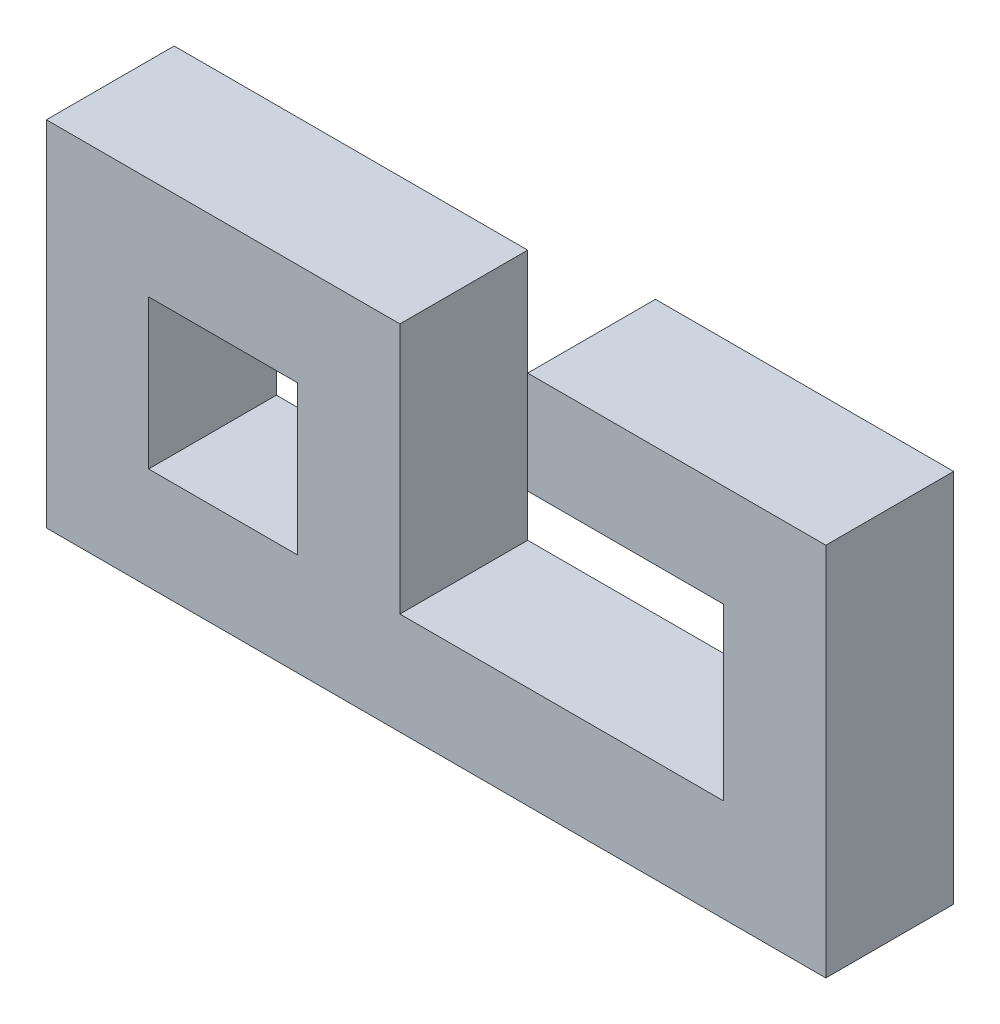
ISO-10303-21;
HEADER;
FILE_DESCRIPTION(('STEP AP214'),'2;1');
FILE_NAME('part.step','',(''),(''),'','','');
FILE_SCHEMA(('AUTOMOTIVE_DESIGN { 1 0 10303 214 1 1 1 1 }'));
ENDSEC;
DATA;
#1=APPLICATION_CONTEXT('core data for automotive mechanical design processes');
#2=APPLICATION_PROTOCOL_DEFINITION('international standard','automotive_design',2000,#1);
#3=PRODUCT_CONTEXT('',#1,'mechanical');
#4=PRODUCT('Part','Part','',(#3));
#5=PRODUCT_RELATED_PRODUCT_CATEGORY('part','',(#4));
#6=PRODUCT_DEFINITION_FORMATION('','',#4);
#7=PRODUCT_DEFINITION_CONTEXT('part definition',#1,'design');
#8=PRODUCT_DEFINITION('design','',#6,#7);
#9=PRODUCT_DEFINITION_SHAPE('','',#8);
#10=(LENGTH_UNIT() NAMED_UNIT(*) SI_UNIT(.MILLI.,.METRE.));
#11=(NAMED_UNIT(*) PLANE_ANGLE_UNIT() SI_UNIT($,.RADIAN.));
#12=(NAMED_UNIT(*) SI_UNIT($,.STERADIAN.) SOLID_ANGLE_UNIT());
#13=UNCERTAINTY_MEASURE_WITH_UNIT(LENGTH_MEASURE(1.E-05),#10,'distance_accuracy_value','');
#14=(GEOMETRIC_REPRESENTATION_CONTEXT(3) GLOBAL_UNCERTAINTY_ASSIGNED_CONTEXT((#13)) GLOBAL_UNIT_ASSIGNED_CONTEXT((#10,
#11,#12)) REPRESENTATION_CONTEXT('',''));
#15=CARTESIAN_POINT('',(0.,0.,0.));
#16=DIRECTION('',(0.,0.,1.));
#17=DIRECTION('',(1.,0.,0.));
#18=AXIS2_PLACEMENT_3D('',#15,#16,#17);
#19=CARTESIAN_POINT('',(0.,0.,3.));
#20=DIRECTION('',(0.,0.,-1.));
#21=DIRECTION('',(-1.,0.,0.));
#22=AXIS2_PLACEMENT_3D('',#19,#20,#21);
#23=PLANE('',#22);
#24=DIRECTION('',(-1.,0.,0.));
#25=VECTOR('',#24,1.);
#26=CARTESIAN_POINT('',(-10.1589932240535,4.48414845360825,3.));
#27=LINE('',#26,#25);
#28=CARTESIAN_POINT('',(-1.85899322405349,4.48414845360825,3.));
#29=VERTEX_POINT('',#28);
#30=CARTESIAN_POINT('',(-10.1589932240535,4.48414845360825,3.));
#31=VERTEX_POINT('',#30);
#32=EDGE_CURVE('E170',#29,#31,#27,.T.);
#33=ORIENTED_EDGE('',*,*,#32,.T.);
#34=DIRECTION('',(0.,-1.,0.));
#35=VECTOR('',#34,1.);
#36=CARTESIAN_POINT('',(-10.1589932240535,4.48414845360825,3.));
#37=LINE('',#36,#35);
#38=CARTESIAN_POINT('',(-10.1589932240535,-3.81585154639175,3.));
#39=VERTEX_POINT('',#38);
#40=EDGE_CURVE('E173',#31,#39,#37,.T.);
#41=ORIENTED_EDGE('',*,*,#40,.T.);
#42=DIRECTION('',(1.,0.,0.));
#43=VECTOR('',#42,1.);
#44=CARTESIAN_POINT('',(-10.1589932240535,-3.81585154639175,3.));
#45=LINE('',#44,#43);
#46=CARTESIAN_POINT('',(8.14100677594651,-3.81585154639175,3.));
#47=VERTEX_POINT('',#46);
#48=EDGE_CURVE('E176',#39,#47,#45,.T.);
#49=ORIENTED_EDGE('',*,*,#48,.T.);
#50=DIRECTION('',(0.,1.,0.));
#51=VECTOR('',#50,1.);
#52=CARTESIAN_POINT('',(8.14100677594651,4.98414845360825,3.));
#53=LINE('',#52,#51);
#54=CARTESIAN_POINT('',(8.14100677594651,4.98414845360825,3.));
#55=VERTEX_POINT('',#54);
#56=EDGE_CURVE('E178',#47,#55,#53,.T.);
#57=ORIENTED_EDGE('',*,*,#56,.T.);
#58=DIRECTION('',(-1.,0.,0.));
#59=VECTOR('',#58,1.);
#60=CARTESIAN_POINT('',(1.14100677594651,4.98414845360825,3.));
#61=LINE('',#60,#59);
#62=CARTESIAN_POINT('',(1.14100677594651,4.98414845360825,3.));
#63=VERTEX_POINT('',#62);
#64=EDGE_CURVE('E180',#55,#63,#61,.T.);
#65=ORIENTED_EDGE('',*,*,#64,.T.);
#66=DIRECTION('',(0.,-1.,0.));
#67=VECTOR('',#66,1.);
#68=CARTESIAN_POINT('',(1.14100677594651,2.58414845360825,3.));
#69=LINE('',#68,#67);
#70=CARTESIAN_POINT('',(1.14100677594651,2.58414845360825,3.));
#71=VERTEX_POINT('',#70);
#72=EDGE_CURVE('E182',#63,#71,#69,.T.);
#73=ORIENTED_EDGE('',*,*,#72,.T.);
#74=DIRECTION('',(1.,0.,0.));
#75=VECTOR('',#74,1.);
#76=CARTESIAN_POINT('',(5.74100677594651,2.58414845360825,3.));
#77=LINE('',#76,#75);
#78=CARTESIAN_POINT('',(5.74100677594651,2.58414845360825,3.));
#79=VERTEX_POINT('',#78);
#80=EDGE_CURVE('E184',#71,#79,#77,.T.);
#81=ORIENTED_EDGE('',*,*,#80,.T.);
#82=DIRECTION('',(0.,-1.,0.));
#83=VECTOR('',#82,1.);
#84=CARTESIAN_POINT('',(5.74100677594651,-1.41585154639175,3.));
#85=LINE('',#84,#83);
#86=CARTESIAN_POINT('',(5.74100677594651,-1.41585154639175,3.));
#87=VERTEX_POINT('',#86);
#88=EDGE_CURVE('E186',#79,#87,#85,.T.);
#89=ORIENTED_EDGE('',*,*,#88,.T.);
#90=DIRECTION('',(-1.,0.,0.));
#91=VECTOR('',#90,1.);
#92=CARTESIAN_POINT('',(-1.85899322405349,-1.41585154639175,3.));
#93=LINE('',#92,#91);
#94=CARTESIAN_POINT('',(-1.85899322405349,-1.41585154639175,3.));
#95=VERTEX_POINT('',#94);
#96=EDGE_CURVE('E188',#87,#95,#93,.T.);
#97=ORIENTED_EDGE('',*,*,#96,.T.);
#98=DIRECTION('',(0.,1.,0.));
#99=VECTOR('',#98,1.);
#100=CARTESIAN_POINT('',(-1.85899322405349,4.48414845360825,3.));
#101=LINE('',#100,#99);
#102=EDGE_CURVE('E190',#95,#29,#101,.T.);
#103=ORIENTED_EDGE('',*,*,#102,.T.);
#104=EDGE_LOOP('',(#33,#41,#49,#57,#65,#73,#81,#89,#97,#103));
#105=FACE_BOUND('',#104,.T.);
#106=DIRECTION('',(0.,-1.,0.));
#107=VECTOR('',#106,1.);
#108=CARTESIAN_POINT('',(-7.75899322405349,2.08414845360825,3.));
#109=LINE('',#108,#107);
#110=CARTESIAN_POINT('',(-7.75899322405349,2.08414845360825,3.));
#111=VERTEX_POINT('',#110);
#112=CARTESIAN_POINT('',(-7.75899322405349,-1.41585154639175,3.));
#113=VERTEX_POINT('',#112);
#114=EDGE_CURVE('E134',#111,#113,#109,.T.);
#115=ORIENTED_EDGE('',*,*,#114,.F.);
#116=DIRECTION('',(-1.,0.,0.));
#117=VECTOR('',#116,1.);
#118=CARTESIAN_POINT('',(-7.75899322405349,2.08414845360825,3.));
#119=LINE('',#118,#117);
#120=CARTESIAN_POINT('',(-4.25899322405349,2.08414845360825,3.));
#121=VERTEX_POINT('',#120);
#122=EDGE_CURVE('E156',#121,#111,#119,.T.);
#123=ORIENTED_EDGE('',*,*,#122,.F.);
#124=DIRECTION('',(0.,1.,0.));
#125=VECTOR('',#124,1.);
#126=CARTESIAN_POINT('',(-4.25899322405349,2.08414845360825,3.));
#127=LINE('',#126,#125);
#128=CARTESIAN_POINT('',(-4.25899322405349,-1.41585154639175,3.));
#129=VERTEX_POINT('',#128);
#130=EDGE_CURVE('E154',#129,#121,#127,.T.);
#131=ORIENTED_EDGE('',*,*,#130,.F.);
#132=DIRECTION('',(1.,0.,0.));
#133=VECTOR('',#132,1.);
#134=CARTESIAN_POINT('',(-7.75899322405349,-1.41585154639175,3.));
#135=LINE('',#134,#133);
#136=EDGE_CURVE('E142',#113,#129,#135,.T.);
#137=ORIENTED_EDGE('',*,*,#136,.F.);
#138=EDGE_LOOP('',(#115,#123,#131,#137));
#139=FACE_BOUND('',#138,.T.);
#140=ADVANCED_FACE('F33',(#105,#139),#23,.F.);
#141=CARTESIAN_POINT('',(0.,0.,0.));
#142=DIRECTION('',(0.,0.,-1.));
#143=DIRECTION('',(-1.,0.,0.));
#144=AXIS2_PLACEMENT_3D('',#141,#142,#143);
#145=PLANE('',#144);
#146=DIRECTION('',(-1.,0.,0.));
#147=VECTOR('',#146,1.);
#148=CARTESIAN_POINT('',(-10.1589932240535,4.48414845360825,0.));
#149=LINE('',#148,#147);
#150=CARTESIAN_POINT('',(-1.85899322405349,4.48414845360825,0.));
#151=VERTEX_POINT('',#150);
#152=CARTESIAN_POINT('',(-10.1589932240535,4.48414845360825,0.));
#153=VERTEX_POINT('',#152);
#154=EDGE_CURVE('E150',#151,#153,#149,.T.);
#155=ORIENTED_EDGE('',*,*,#154,.F.);
#156=DIRECTION('',(0.,1.,0.));
#157=VECTOR('',#156,1.);
#158=CARTESIAN_POINT('',(-1.85899322405349,4.48414845360825,0.));
#159=LINE('',#158,#157);
#160=CARTESIAN_POINT('',(-1.85899322405349,-1.41585154639175,0.));
#161=VERTEX_POINT('',#160);
#162=EDGE_CURVE('E174',#161,#151,#159,.T.);
#163=ORIENTED_EDGE('',*,*,#162,.F.);
#164=DIRECTION('',(-1.,0.,0.));
#165=VECTOR('',#164,1.);
#166=CARTESIAN_POINT('',(-1.85899322405349,-1.41585154639175,0.));
#167=LINE('',#166,#165);
#168=CARTESIAN_POINT('',(5.74100677594651,-1.41585154639175,0.));
#169=VERTEX_POINT('',#168);
#170=EDGE_CURVE('E209',#169,#161,#167,.T.);
#171=ORIENTED_EDGE('',*,*,#170,.F.);
#172=DIRECTION('',(0.,-1.,0.));
#173=VECTOR('',#172,1.);
#174=CARTESIAN_POINT('',(5.74100677594651,-1.41585154639175,0.));
#175=LINE('',#174,#173);
#176=CARTESIAN_POINT('',(5.74100677594651,2.58414845360825,0.));
#177=VERTEX_POINT('',#176);
#178=EDGE_CURVE('E207',#177,#169,#175,.T.);
#179=ORIENTED_EDGE('',*,*,#178,.F.);
#180=DIRECTION('',(1.,0.,0.));
#181=VECTOR('',#180,1.);
#182=CARTESIAN_POINT('',(5.74100677594651,2.58414845360825,0.));
#183=LINE('',#182,#181);
#184=CARTESIAN_POINT('',(1.14100677594651,2.58414845360825,0.));
#185=VERTEX_POINT('',#184);
#186=EDGE_CURVE('E205',#185,#177,#183,.T.);
#187=ORIENTED_EDGE('',*,*,#186,.F.);
#188=DIRECTION('',(0.,-1.,0.));
#189=VECTOR('',#188,1.);
#190=CARTESIAN_POINT('',(1.14100677594651,2.58414845360825,0.));
#191=LINE('',#190,#189);
#192=CARTESIAN_POINT('',(1.14100677594651,4.98414845360825,0.));
#193=VERTEX_POINT('',#192);
#194=EDGE_CURVE('E203',#193,#185,#191,.T.);
#195=ORIENTED_EDGE('',*,*,#194,.F.);
#196=DIRECTION('',(-1.,0.,0.));
#197=VECTOR('',#196,1.);
#198=CARTESIAN_POINT('',(1.14100677594651,4.98414845360825,0.));
#199=LINE('',#198,#197);
#200=CARTESIAN_POINT('',(8.14100677594651,4.98414845360825,0.));
#201=VERTEX_POINT('',#200);
#202=EDGE_CURVE('E201',#201,#193,#199,.T.);
#203=ORIENTED_EDGE('',*,*,#202,.F.);
#204=DIRECTION('',(0.,1.,0.));
#205=VECTOR('',#204,1.);
#206=CARTESIAN_POINT('',(8.14100677594651,4.98414845360825,0.));
#207=LINE('',#206,#205);
#208=CARTESIAN_POINT('',(8.14100677594651,-3.81585154639175,0.));
#209=VERTEX_POINT('',#208);
#210=EDGE_CURVE('E199',#209,#201,#207,.T.);
#211=ORIENTED_EDGE('',*,*,#210,.F.);
#212=DIRECTION('',(1.,0.,0.));
#213=VECTOR('',#212,1.);
#214=CARTESIAN_POINT('',(-10.1589932240535,-3.81585154639175,0.));
#215=LINE('',#214,#213);
#216=CARTESIAN_POINT('',(-10.1589932240535,-3.81585154639175,0.));
#217=VERTEX_POINT('',#216);
#218=EDGE_CURVE('E197',#217,#209,#215,.T.);
#219=ORIENTED_EDGE('',*,*,#218,.F.);
#220=DIRECTION('',(0.,-1.,0.));
#221=VECTOR('',#220,1.);
#222=CARTESIAN_POINT('',(-10.1589932240535,4.48414845360825,0.));
#223=LINE('',#222,#221);
#224=EDGE_CURVE('E195',#153,#217,#223,.T.);
#225=ORIENTED_EDGE('',*,*,#224,.F.);
#226=EDGE_LOOP('',(#155,#163,#171,#179,#187,#195,#203,#211,#219,#225));
#227=FACE_BOUND('',#226,.T.);
#228=DIRECTION('',(-1.,0.,0.));
#229=VECTOR('',#228,1.);
#230=CARTESIAN_POINT('',(-7.75899322405349,2.08414845360825,0.));
#231=LINE('',#230,#229);
#232=CARTESIAN_POINT('',(-4.25899322405349,2.08414845360825,0.));
#233=VERTEX_POINT('',#232);
#234=CARTESIAN_POINT('',(-7.75899322405349,2.08414845360825,0.));
#235=VERTEX_POINT('',#234);
#236=EDGE_CURVE('E143',#233,#235,#231,.T.);
#237=ORIENTED_EDGE('',*,*,#236,.T.);
#238=DIRECTION('',(0.,-1.,0.));
#239=VECTOR('',#238,1.);
#240=CARTESIAN_POINT('',(-7.75899322405349,2.08414845360825,0.));
#241=LINE('',#240,#239);
#242=CARTESIAN_POINT('',(-7.75899322405349,-1.41585154639175,0.));
#243=VERTEX_POINT('',#242);
#244=EDGE_CURVE('E56',#235,#243,#241,.T.);
#245=ORIENTED_EDGE('',*,*,#244,.T.);
#246=DIRECTION('',(1.,0.,0.));
#247=VECTOR('',#246,1.);
#248=CARTESIAN_POINT('',(-7.75899322405349,-1.41585154639175,0.));
#249=LINE('',#248,#247);
#250=CARTESIAN_POINT('',(-4.25899322405349,-1.41585154639175,0.));
#251=VERTEX_POINT('',#250);
#252=EDGE_CURVE('E149',#243,#251,#249,.T.);
#253=ORIENTED_EDGE('',*,*,#252,.T.);
#254=DIRECTION('',(0.,1.,0.));
#255=VECTOR('',#254,1.);
#256=CARTESIAN_POINT('',(-4.25899322405349,2.08414845360825,0.));
#257=LINE('',#256,#255);
#258=EDGE_CURVE('E162',#251,#233,#257,.T.);
#259=ORIENTED_EDGE('',*,*,#258,.T.);
#260=EDGE_LOOP('',(#237,#245,#253,#259));
#261=FACE_BOUND('',#260,.T.);
#262=ADVANCED_FACE('F245',(#227,#261),#145,.T.);
#263=CARTESIAN_POINT('',(-10.1589932240535,4.48414845360825,3.));
#264=DIRECTION('',(0.,-1.,0.));
#265=DIRECTION('',(0.,0.,-1.));
#266=AXIS2_PLACEMENT_3D('',#263,#264,#265);
#267=PLANE('',#266);
#268=ORIENTED_EDGE('',*,*,#154,.T.);
#269=DIRECTION('',(0.,0.,-1.));
#270=VECTOR('',#269,1.);
#271=CARTESIAN_POINT('',(-10.1589932240535,4.48414845360825,3.));
#272=LINE('',#271,#270);
#273=EDGE_CURVE('E11',#31,#153,#272,.T.);
#274=ORIENTED_EDGE('',*,*,#273,.F.);
#275=ORIENTED_EDGE('',*,*,#32,.F.);
#276=DIRECTION('',(0.,0.,-1.));
#277=VECTOR('',#276,1.);
#278=CARTESIAN_POINT('',(-1.85899322405349,4.48414845360825,3.));
#279=LINE('',#278,#277);
#280=EDGE_CURVE('E192',#29,#151,#279,.T.);
#281=ORIENTED_EDGE('',*,*,#280,.T.);
#282=EDGE_LOOP('',(#268,#274,#275,#281));
#283=FACE_BOUND('',#282,.T.);
#284=ADVANCED_FACE('F35',(#283),#267,.F.);
#285=CARTESIAN_POINT('',(-10.1589932240535,4.48414845360825,3.));
#286=DIRECTION('',(1.,0.,0.));
#287=DIRECTION('',(0.,0.,-1.));
#288=AXIS2_PLACEMENT_3D('',#285,#286,#287);
#289=PLANE('',#288);
#290=ORIENTED_EDGE('',*,*,#224,.T.);
#291=DIRECTION('',(0.,0.,-1.));
#292=VECTOR('',#291,1.);
#293=CARTESIAN_POINT('',(-10.1589932240535,-3.81585154639175,3.));
#294=LINE('',#293,#292);
#295=EDGE_CURVE('E41',#39,#217,#294,.T.);
#296=ORIENTED_EDGE('',*,*,#295,.F.);
#297=ORIENTED_EDGE('',*,*,#40,.F.);
#298=ORIENTED_EDGE('',*,*,#273,.T.);
#299=EDGE_LOOP('',(#290,#296,#297,#298));
#300=FACE_BOUND('',#299,.T.);
#301=ADVANCED_FACE('F262',(#300),#289,.F.);
#302=CARTESIAN_POINT('',(-10.1589932240535,-3.81585154639175,3.));
#303=DIRECTION('',(0.,1.,0.));
#304=DIRECTION('',(0.,0.,1.));
#305=AXIS2_PLACEMENT_3D('',#302,#303,#304);
#306=PLANE('',#305);
#307=ORIENTED_EDGE('',*,*,#218,.T.);
#308=DIRECTION('',(0.,0.,-1.));
#309=VECTOR('',#308,1.);
#310=CARTESIAN_POINT('',(8.14100677594651,-3.81585154639175,3.));
#311=LINE('',#310,#309);
#312=EDGE_CURVE('E232',#47,#209,#311,.T.);
#313=ORIENTED_EDGE('',*,*,#312,.F.);
#314=ORIENTED_EDGE('',*,*,#48,.F.);
#315=ORIENTED_EDGE('',*,*,#295,.T.);
#316=EDGE_LOOP('',(#307,#313,#314,#315));
#317=FACE_BOUND('',#316,.T.);
#318=ADVANCED_FACE('F239',(#317),#306,.F.);
#319=CARTESIAN_POINT('',(8.14100677594651,4.98414845360825,3.));
#320=DIRECTION('',(-1.,0.,0.));
#321=DIRECTION('',(0.,0.,1.));
#322=AXIS2_PLACEMENT_3D('',#319,#320,#321);
#323=PLANE('',#322);
#324=ORIENTED_EDGE('',*,*,#210,.T.);
#325=DIRECTION('',(0.,0.,-1.));
#326=VECTOR('',#325,1.);
#327=CARTESIAN_POINT('',(8.14100677594651,4.98414845360825,3.));
#328=LINE('',#327,#326);
#329=EDGE_CURVE('E229',#55,#201,#328,.T.);
#330=ORIENTED_EDGE('',*,*,#329,.F.);
#331=ORIENTED_EDGE('',*,*,#56,.F.);
#332=ORIENTED_EDGE('',*,*,#312,.T.);
#333=EDGE_LOOP('',(#324,#330,#331,#332));
#334=FACE_BOUND('',#333,.T.);
#335=ADVANCED_FACE('F251',(#334),#323,.F.);
#336=CARTESIAN_POINT('',(1.14100677594651,4.98414845360825,3.));
#337=DIRECTION('',(0.,-1.,0.));
#338=DIRECTION('',(1.,0.,0.));
#339=AXIS2_PLACEMENT_3D('',#336,#337,#338);
#340=PLANE('',#339);
#341=ORIENTED_EDGE('',*,*,#202,.T.);
#342=DIRECTION('',(0.,0.,-1.));
#343=VECTOR('',#342,1.);
#344=CARTESIAN_POINT('',(1.14100677594651,4.98414845360825,3.));
#345=LINE('',#344,#343);
#346=EDGE_CURVE('E226',#63,#193,#345,.T.);
#347=ORIENTED_EDGE('',*,*,#346,.F.);
#348=ORIENTED_EDGE('',*,*,#64,.F.);
#349=ORIENTED_EDGE('',*,*,#329,.T.);
#350=EDGE_LOOP('',(#341,#347,#348,#349));
#351=FACE_BOUND('',#350,.T.);
#352=ADVANCED_FACE('F255',(#351),#340,.F.);
#353=CARTESIAN_POINT('',(1.14100677594651,2.58414845360825,3.));
#354=DIRECTION('',(1.,0.,0.));
#355=DIRECTION('',(0.,0.,-1.));
#356=AXIS2_PLACEMENT_3D('',#353,#354,#355);
#357=PLANE('',#356);
#358=ORIENTED_EDGE('',*,*,#194,.T.);
#359=DIRECTION('',(0.,0.,-1.));
#360=VECTOR('',#359,1.);
#361=CARTESIAN_POINT('',(1.14100677594651,2.58414845360825,3.));
#362=LINE('',#361,#360);
#363=EDGE_CURVE('E223',#71,#185,#362,.T.);
#364=ORIENTED_EDGE('',*,*,#363,.F.);
#365=ORIENTED_EDGE('',*,*,#72,.F.);
#366=ORIENTED_EDGE('',*,*,#346,.T.);
#367=EDGE_LOOP('',(#358,#364,#365,#366));
#368=FACE_BOUND('',#367,.T.);
#369=ADVANCED_FACE('F285',(#368),#357,.F.);
#370=CARTESIAN_POINT('',(5.74100677594651,2.58414845360825,3.));
#371=DIRECTION('',(0.,1.,0.));
#372=DIRECTION('',(-1.,0.,0.));
#373=AXIS2_PLACEMENT_3D('',#370,#371,#372);
#374=PLANE('',#373);
#375=ORIENTED_EDGE('',*,*,#186,.T.);
#376=DIRECTION('',(0.,0.,-1.));
#377=VECTOR('',#376,1.);
#378=CARTESIAN_POINT('',(5.74100677594651,2.58414845360825,3.));
#379=LINE('',#378,#377);
#380=EDGE_CURVE('E220',#79,#177,#379,.T.);
#381=ORIENTED_EDGE('',*,*,#380,.F.);
#382=ORIENTED_EDGE('',*,*,#80,.F.);
#383=ORIENTED_EDGE('',*,*,#363,.T.);
#384=EDGE_LOOP('',(#375,#381,#382,#383));
#385=FACE_BOUND('',#384,.T.);
#386=ADVANCED_FACE('F282',(#385),#374,.F.);
#387=CARTESIAN_POINT('',(5.74100677594651,-1.41585154639175,3.));
#388=DIRECTION('',(1.,0.,0.));
#389=DIRECTION('',(0.,0.,-1.));
#390=AXIS2_PLACEMENT_3D('',#387,#388,#389);
#391=PLANE('',#390);
#392=ORIENTED_EDGE('',*,*,#178,.T.);
#393=DIRECTION('',(0.,0.,-1.));
#394=VECTOR('',#393,1.);
#395=CARTESIAN_POINT('',(5.74100677594651,-1.41585154639175,3.));
#396=LINE('',#395,#394);
#397=EDGE_CURVE('E217',#87,#169,#396,.T.);
#398=ORIENTED_EDGE('',*,*,#397,.F.);
#399=ORIENTED_EDGE('',*,*,#88,.F.);
#400=ORIENTED_EDGE('',*,*,#380,.T.);
#401=EDGE_LOOP('',(#392,#398,#399,#400));
#402=FACE_BOUND('',#401,.T.);
#403=ADVANCED_FACE('F278',(#402),#391,.F.);
#404=CARTESIAN_POINT('',(-1.85899322405349,-1.41585154639175,3.));
#405=DIRECTION('',(0.,-1.,0.));
#406=DIRECTION('',(0.,0.,-1.));
#407=AXIS2_PLACEMENT_3D('',#404,#405,#406);
#408=PLANE('',#407);
#409=ORIENTED_EDGE('',*,*,#170,.T.);
#410=DIRECTION('',(0.,0.,-1.));
#411=VECTOR('',#410,1.);
#412=CARTESIAN_POINT('',(-1.85899322405349,-1.41585154639175,3.));
#413=LINE('',#412,#411);
#414=EDGE_CURVE('E214',#95,#161,#413,.T.);
#415=ORIENTED_EDGE('',*,*,#414,.F.);
#416=ORIENTED_EDGE('',*,*,#96,.F.);
#417=ORIENTED_EDGE('',*,*,#397,.T.);
#418=EDGE_LOOP('',(#409,#415,#416,#417));
#419=FACE_BOUND('',#418,.T.);
#420=ADVANCED_FACE('F274',(#419),#408,.F.);
#421=CARTESIAN_POINT('',(-1.85899322405349,4.48414845360825,3.));
#422=DIRECTION('',(-1.,0.,0.));
#423=DIRECTION('',(0.,-1.,0.));
#424=AXIS2_PLACEMENT_3D('',#421,#422,#423);
#425=PLANE('',#424);
#426=ORIENTED_EDGE('',*,*,#162,.T.);
#427=ORIENTED_EDGE('',*,*,#280,.F.);
#428=ORIENTED_EDGE('',*,*,#102,.F.);
#429=ORIENTED_EDGE('',*,*,#414,.T.);
#430=EDGE_LOOP('',(#426,#427,#428,#429));
#431=FACE_BOUND('',#430,.T.);
#432=ADVANCED_FACE('F269',(#431),#425,.F.);
#433=CARTESIAN_POINT('',(-7.75899322405349,2.08414845360825,3.));
#434=DIRECTION('',(1.,0.,0.));
#435=DIRECTION('',(0.,0.,-1.));
#436=AXIS2_PLACEMENT_3D('',#433,#434,#435);
#437=PLANE('',#436);
#438=ORIENTED_EDGE('',*,*,#244,.F.);
#439=DIRECTION('',(0.,0.,-1.));
#440=VECTOR('',#439,1.);
#441=CARTESIAN_POINT('',(-7.75899322405349,2.08414845360825,3.));
#442=LINE('',#441,#440);
#443=EDGE_CURVE('E138',#111,#235,#442,.T.);
#444=ORIENTED_EDGE('',*,*,#443,.F.);
#445=ORIENTED_EDGE('',*,*,#114,.T.);
#446=DIRECTION('',(0.,0.,-1.));
#447=VECTOR('',#446,1.);
#448=CARTESIAN_POINT('',(-7.75899322405349,-1.41585154639175,3.));
#449=LINE('',#448,#447);
#450=EDGE_CURVE('E137',#113,#243,#449,.T.);
#451=ORIENTED_EDGE('',*,*,#450,.T.);
#452=EDGE_LOOP('',(#438,#444,#445,#451));
#453=FACE_BOUND('',#452,.T.);
#454=ADVANCED_FACE('F136',(#453),#437,.T.);
#455=CARTESIAN_POINT('',(-7.75899322405349,-1.41585154639175,3.));
#456=DIRECTION('',(0.,1.,0.));
#457=DIRECTION('',(0.,0.,1.));
#458=AXIS2_PLACEMENT_3D('',#455,#456,#457);
#459=PLANE('',#458);
#460=ORIENTED_EDGE('',*,*,#252,.F.);
#461=ORIENTED_EDGE('',*,*,#450,.F.);
#462=ORIENTED_EDGE('',*,*,#136,.T.);
#463=DIRECTION('',(0.,0.,-1.));
#464=VECTOR('',#463,1.);
#465=CARTESIAN_POINT('',(-4.25899322405349,-1.41585154639175,3.));
#466=LINE('',#465,#464);
#467=EDGE_CURVE('E151',#129,#251,#466,.T.);
#468=ORIENTED_EDGE('',*,*,#467,.T.);
#469=EDGE_LOOP('',(#460,#461,#462,#468));
#470=FACE_BOUND('',#469,.T.);
#471=ADVANCED_FACE('F146',(#470),#459,.T.);
#472=CARTESIAN_POINT('',(-4.25899322405349,2.08414845360825,3.));
#473=DIRECTION('',(-1.,0.,0.));
#474=DIRECTION('',(0.,0.,1.));
#475=AXIS2_PLACEMENT_3D('',#472,#473,#474);
#476=PLANE('',#475);
#477=ORIENTED_EDGE('',*,*,#258,.F.);
#478=ORIENTED_EDGE('',*,*,#467,.F.);
#479=ORIENTED_EDGE('',*,*,#130,.T.);
#480=DIRECTION('',(0.,0.,-1.));
#481=VECTOR('',#480,1.);
#482=CARTESIAN_POINT('',(-4.25899322405349,2.08414845360825,3.));
#483=LINE('',#482,#481);
#484=EDGE_CURVE('E48',#121,#233,#483,.T.);
#485=ORIENTED_EDGE('',*,*,#484,.T.);
#486=EDGE_LOOP('',(#477,#478,#479,#485));
#487=FACE_BOUND('',#486,.T.);
#488=ADVANCED_FACE('F331',(#487),#476,.T.);
#489=CARTESIAN_POINT('',(-7.75899322405349,2.08414845360825,3.));
#490=DIRECTION('',(0.,-1.,0.));
#491=DIRECTION('',(1.,0.,0.));
#492=AXIS2_PLACEMENT_3D('',#489,#490,#491);
#493=PLANE('',#492);
#494=ORIENTED_EDGE('',*,*,#236,.F.);
#495=ORIENTED_EDGE('',*,*,#484,.F.);
#496=ORIENTED_EDGE('',*,*,#122,.T.);
#497=ORIENTED_EDGE('',*,*,#443,.T.);
#498=EDGE_LOOP('',(#494,#495,#496,#497));
#499=FACE_BOUND('',#498,.T.);
#500=ADVANCED_FACE('F337',(#499),#493,.T.);
#501=CLOSED_SHELL('',(#140,#262,#284,#301,#318,#335,#352,#369,#386,#403,#420,#432,#454,#471,
#488,#500));
#502=MANIFOLD_SOLID_BREP('B2',#501);
#503=ADVANCED_BREP_SHAPE_REPRESENTATION('',(#18,#502),#14);
#504=SHAPE_DEFINITION_REPRESENTATION(#9,#503);
ENDSEC;
END-ISO-10303-21;
